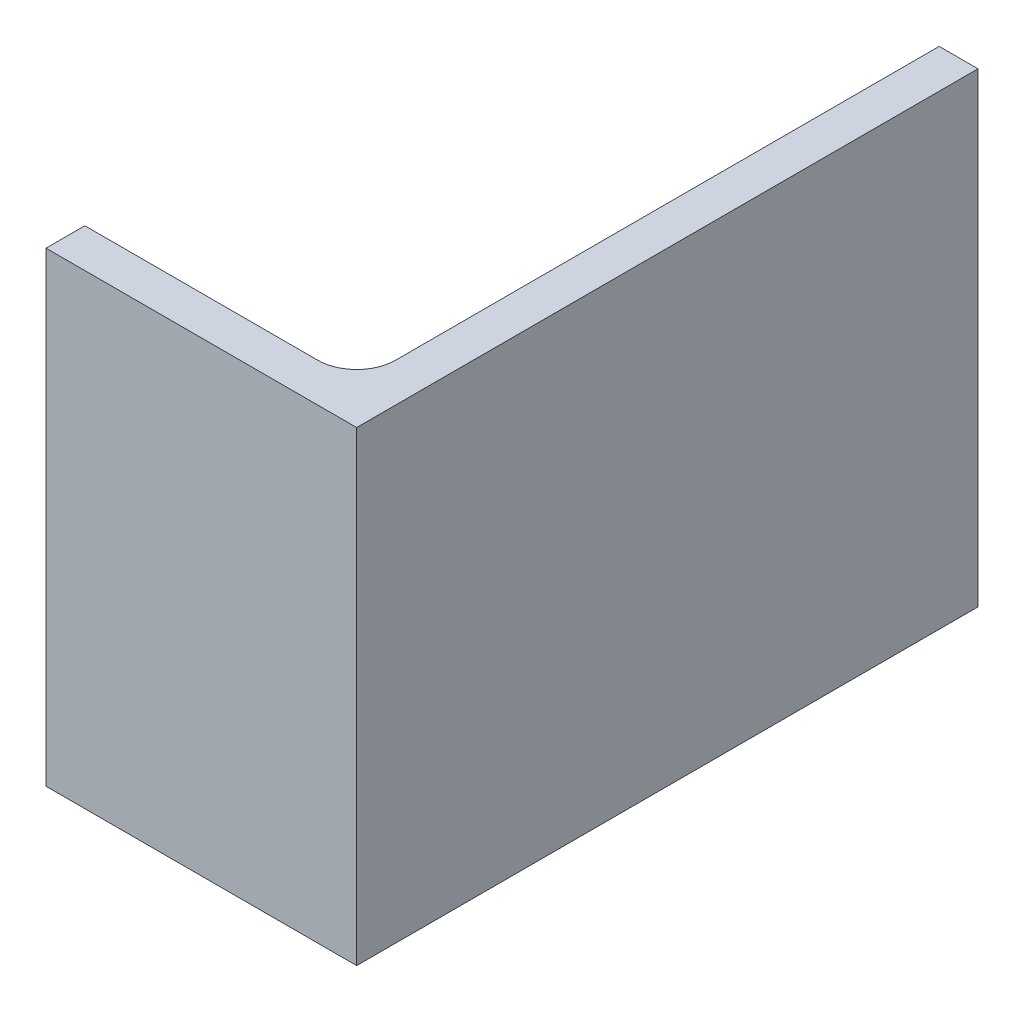
ISO-10303-21;
HEADER;
FILE_DESCRIPTION(('STEP AP214'),'2;1');
FILE_NAME('part.step','',(''),(''),'','','');
FILE_SCHEMA(('AUTOMOTIVE_DESIGN { 1 0 10303 214 1 1 1 1 }'));
ENDSEC;
DATA;
#1=APPLICATION_CONTEXT('core data for automotive mechanical design processes');
#2=APPLICATION_PROTOCOL_DEFINITION('international standard','automotive_design',2000,#1);
#3=PRODUCT_CONTEXT('',#1,'mechanical');
#4=PRODUCT('Part','Part','',(#3));
#5=PRODUCT_RELATED_PRODUCT_CATEGORY('part','',(#4));
#6=PRODUCT_DEFINITION_FORMATION('','',#4);
#7=PRODUCT_DEFINITION_CONTEXT('part definition',#1,'design');
#8=PRODUCT_DEFINITION('design','',#6,#7);
#9=PRODUCT_DEFINITION_SHAPE('','',#8);
#10=(LENGTH_UNIT() NAMED_UNIT(*) SI_UNIT(.MILLI.,.METRE.));
#11=(NAMED_UNIT(*) PLANE_ANGLE_UNIT() SI_UNIT($,.RADIAN.));
#12=(NAMED_UNIT(*) SI_UNIT($,.STERADIAN.) SOLID_ANGLE_UNIT());
#13=UNCERTAINTY_MEASURE_WITH_UNIT(LENGTH_MEASURE(1.E-05),#10,'distance_accuracy_value','');
#14=(GEOMETRIC_REPRESENTATION_CONTEXT(3) GLOBAL_UNCERTAINTY_ASSIGNED_CONTEXT((#13)) GLOBAL_UNIT_ASSIGNED_CONTEXT((#10,
#11,#12)) REPRESENTATION_CONTEXT('',''));
#15=CARTESIAN_POINT('',(0.,0.,0.));
#16=DIRECTION('',(0.,0.,1.));
#17=DIRECTION('',(1.,0.,0.));
#18=AXIS2_PLACEMENT_3D('',#15,#16,#17);
#19=CARTESIAN_POINT('',(-12.7,19.05,-50.8));
#20=DIRECTION('',(-1.,0.,0.));
#21=DIRECTION('',(0.,-1.,0.));
#22=AXIS2_PLACEMENT_3D('',#19,#20,#21);
#23=PLANE('',#22);
#24=DIRECTION('',(0.,0.,1.));
#25=VECTOR('',#24,1.);
#26=CARTESIAN_POINT('',(-12.7,19.05,-50.8));
#27=LINE('',#26,#25);
#28=CARTESIAN_POINT('',(-12.7,19.05,-3.175));
#29=VERTEX_POINT('',#28);
#30=CARTESIAN_POINT('',(-12.7,19.05,0.));
#31=VERTEX_POINT('',#30);
#32=EDGE_CURVE('E178',#29,#31,#27,.T.);
#33=ORIENTED_EDGE('',*,*,#32,.F.);
#34=DIRECTION('',(0.,-1.,0.));
#35=VECTOR('',#34,1.);
#36=CARTESIAN_POINT('',(-12.7,0.,-3.175));
#37=LINE('',#36,#35);
#38=CARTESIAN_POINT('',(-12.7,-12.7,-3.175));
#39=VERTEX_POINT('',#38);
#40=EDGE_CURVE('E216',#29,#39,#37,.T.);
#41=ORIENTED_EDGE('',*,*,#40,.T.);
#42=CARTESIAN_POINT('',(-12.7,-12.7,-6.35));
#43=DIRECTION('',(-1.,0.,0.));
#44=DIRECTION('',(0.,-1.,0.));
#45=AXIS2_PLACEMENT_3D('',#42,#43,#44);
#46=CIRCLE('',#45,3.175);
#47=CARTESIAN_POINT('',(-12.7,-15.875,-6.35));
#48=VERTEX_POINT('',#47);
#49=EDGE_CURVE('E136',#39,#48,#46,.F.);
#50=ORIENTED_EDGE('',*,*,#49,.T.);
#51=DIRECTION('',(0.,0.,1.));
#52=VECTOR('',#51,1.);
#53=CARTESIAN_POINT('',(-12.7,-15.875,-50.8));
#54=LINE('',#53,#52);
#55=CARTESIAN_POINT('',(-12.7,-15.875,-50.8));
#56=VERTEX_POINT('',#55);
#57=EDGE_CURVE('E121',#56,#48,#54,.T.);
#58=ORIENTED_EDGE('',*,*,#57,.F.);
#59=DIRECTION('',(0.,-1.,0.));
#60=VECTOR('',#59,1.);
#61=CARTESIAN_POINT('',(-12.7,19.05,-50.8));
#62=LINE('',#61,#60);
#63=CARTESIAN_POINT('',(-12.7,-19.05,-50.8));
#64=VERTEX_POINT('',#63);
#65=EDGE_CURVE('E132',#56,#64,#62,.T.);
#66=ORIENTED_EDGE('',*,*,#65,.T.);
#67=DIRECTION('',(0.,0.,1.));
#68=VECTOR('',#67,1.);
#69=CARTESIAN_POINT('',(-12.7,-19.05,-50.8));
#70=LINE('',#69,#68);
#71=CARTESIAN_POINT('',(-12.7,-19.05,0.));
#72=VERTEX_POINT('',#71);
#73=EDGE_CURVE('E175',#64,#72,#70,.T.);
#74=ORIENTED_EDGE('',*,*,#73,.T.);
#75=DIRECTION('',(0.,-1.,0.));
#76=VECTOR('',#75,1.);
#77=CARTESIAN_POINT('',(-12.7,19.05,0.));
#78=LINE('',#77,#76);
#79=EDGE_CURVE('E164',#31,#72,#78,.T.);
#80=ORIENTED_EDGE('',*,*,#79,.F.);
#81=EDGE_LOOP('',(#33,#41,#50,#58,#66,#74,#80));
#82=FACE_BOUND('',#81,.T.);
#83=ADVANCED_FACE('F42',(#82),#23,.T.);
#84=CARTESIAN_POINT('',(-12.7,19.05,-50.8));
#85=DIRECTION('',(0.,1.,0.));
#86=DIRECTION('',(0.,0.,1.));
#87=AXIS2_PLACEMENT_3D('',#84,#85,#86);
#88=PLANE('',#87);
#89=DIRECTION('',(0.,0.,1.));
#90=VECTOR('',#89,1.);
#91=CARTESIAN_POINT('',(9.525,19.05,-50.8));
#92=LINE('',#91,#90);
#93=CARTESIAN_POINT('',(9.525,19.05,-50.8));
#94=VERTEX_POINT('',#93);
#95=CARTESIAN_POINT('',(9.525,19.05,-6.35));
#96=VERTEX_POINT('',#95);
#97=EDGE_CURVE('E127',#94,#96,#92,.T.);
#98=ORIENTED_EDGE('',*,*,#97,.T.);
#99=CARTESIAN_POINT('',(6.35,19.05,-6.35));
#100=DIRECTION('',(0.,1.,0.));
#101=DIRECTION('',(0.,0.,1.));
#102=AXIS2_PLACEMENT_3D('',#99,#100,#101);
#103=CIRCLE('',#102,3.175);
#104=CARTESIAN_POINT('',(6.35,19.05,-3.175));
#105=VERTEX_POINT('',#104);
#106=EDGE_CURVE('E52',#96,#105,#103,.F.);
#107=ORIENTED_EDGE('',*,*,#106,.T.);
#108=DIRECTION('',(-1.,0.,0.));
#109=VECTOR('',#108,1.);
#110=CARTESIAN_POINT('',(0.,19.05,-3.175));
#111=LINE('',#110,#109);
#112=EDGE_CURVE('E213',#105,#29,#111,.T.);
#113=ORIENTED_EDGE('',*,*,#112,.T.);
#114=ORIENTED_EDGE('',*,*,#32,.T.);
#115=DIRECTION('',(-1.,0.,0.));
#116=VECTOR('',#115,1.);
#117=CARTESIAN_POINT('',(-12.7,19.05,0.));
#118=LINE('',#117,#116);
#119=CARTESIAN_POINT('',(12.7,19.05,0.));
#120=VERTEX_POINT('',#119);
#121=EDGE_CURVE('E160',#120,#31,#118,.T.);
#122=ORIENTED_EDGE('',*,*,#121,.F.);
#123=DIRECTION('',(0.,0.,1.));
#124=VECTOR('',#123,1.);
#125=CARTESIAN_POINT('',(12.7,19.05,-50.8));
#126=LINE('',#125,#124);
#127=CARTESIAN_POINT('',(12.7,19.05,-50.8));
#128=VERTEX_POINT('',#127);
#129=EDGE_CURVE('E150',#128,#120,#126,.T.);
#130=ORIENTED_EDGE('',*,*,#129,.F.);
#131=DIRECTION('',(-1.,0.,0.));
#132=VECTOR('',#131,1.);
#133=CARTESIAN_POINT('',(-12.7,19.05,-50.8));
#134=LINE('',#133,#132);
#135=EDGE_CURVE('E146',#128,#94,#134,.T.);
#136=ORIENTED_EDGE('',*,*,#135,.T.);
#137=EDGE_LOOP('',(#98,#107,#113,#114,#122,#130,#136));
#138=FACE_BOUND('',#137,.T.);
#139=ADVANCED_FACE('F239',(#138),#88,.T.);
#140=CARTESIAN_POINT('',(12.7,19.05,-50.8));
#141=DIRECTION('',(1.,0.,0.));
#142=DIRECTION('',(0.,1.,0.));
#143=AXIS2_PLACEMENT_3D('',#140,#141,#142);
#144=PLANE('',#143);
#145=DIRECTION('',(0.,1.,0.));
#146=VECTOR('',#145,1.);
#147=CARTESIAN_POINT('',(12.7,19.05,0.));
#148=LINE('',#147,#146);
#149=CARTESIAN_POINT('',(12.7,-19.05,0.));
#150=VERTEX_POINT('',#149);
#151=EDGE_CURVE('E138',#150,#120,#148,.T.);
#152=ORIENTED_EDGE('',*,*,#151,.F.);
#153=DIRECTION('',(0.,0.,1.));
#154=VECTOR('',#153,1.);
#155=CARTESIAN_POINT('',(12.7,-19.05,-50.8));
#156=LINE('',#155,#154);
#157=CARTESIAN_POINT('',(12.7,-19.05,-50.8));
#158=VERTEX_POINT('',#157);
#159=EDGE_CURVE('E172',#158,#150,#156,.T.);
#160=ORIENTED_EDGE('',*,*,#159,.F.);
#161=DIRECTION('',(0.,1.,0.));
#162=VECTOR('',#161,1.);
#163=CARTESIAN_POINT('',(12.7,19.05,-50.8));
#164=LINE('',#163,#162);
#165=EDGE_CURVE('E153',#158,#128,#164,.T.);
#166=ORIENTED_EDGE('',*,*,#165,.T.);
#167=ORIENTED_EDGE('',*,*,#129,.T.);
#168=EDGE_LOOP('',(#152,#160,#166,#167));
#169=FACE_BOUND('',#168,.T.);
#170=ADVANCED_FACE('F230',(#169),#144,.T.);
#171=CARTESIAN_POINT('',(-12.7,-19.05,-50.8));
#172=DIRECTION('',(0.,-1.,0.));
#173=DIRECTION('',(0.,0.,-1.));
#174=AXIS2_PLACEMENT_3D('',#171,#172,#173);
#175=PLANE('',#174);
#176=DIRECTION('',(1.,0.,0.));
#177=VECTOR('',#176,1.);
#178=CARTESIAN_POINT('',(-12.7,-19.05,0.));
#179=LINE('',#178,#177);
#180=EDGE_CURVE('E168',#72,#150,#179,.T.);
#181=ORIENTED_EDGE('',*,*,#180,.F.);
#182=ORIENTED_EDGE('',*,*,#73,.F.);
#183=DIRECTION('',(1.,0.,0.));
#184=VECTOR('',#183,1.);
#185=CARTESIAN_POINT('',(-12.7,-19.05,-50.8));
#186=LINE('',#185,#184);
#187=EDGE_CURVE('E144',#64,#158,#186,.T.);
#188=ORIENTED_EDGE('',*,*,#187,.T.);
#189=ORIENTED_EDGE('',*,*,#159,.T.);
#190=EDGE_LOOP('',(#181,#182,#188,#189));
#191=FACE_BOUND('',#190,.T.);
#192=ADVANCED_FACE('F235',(#191),#175,.T.);
#193=CARTESIAN_POINT('',(0.,0.,-50.8));
#194=DIRECTION('',(0.,0.,1.));
#195=DIRECTION('',(1.,0.,0.));
#196=AXIS2_PLACEMENT_3D('',#193,#194,#195);
#197=PLANE('',#196);
#198=DIRECTION('',(1.,0.,0.));
#199=VECTOR('',#198,1.);
#200=CARTESIAN_POINT('',(0.,-15.875,-50.8));
#201=LINE('',#200,#199);
#202=CARTESIAN_POINT('',(6.35,-15.875,-50.8));
#203=VERTEX_POINT('',#202);
#204=EDGE_CURVE('E117',#56,#203,#201,.T.);
#205=ORIENTED_EDGE('',*,*,#204,.T.);
#206=CARTESIAN_POINT('',(6.35,-12.7,-50.8));
#207=DIRECTION('',(0.,0.,1.));
#208=DIRECTION('',(1.,0.,0.));
#209=AXIS2_PLACEMENT_3D('',#206,#207,#208);
#210=CIRCLE('',#209,3.175);
#211=CARTESIAN_POINT('',(9.525,-12.7,-50.8));
#212=VERTEX_POINT('',#211);
#213=EDGE_CURVE('E11',#203,#212,#210,.T.);
#214=ORIENTED_EDGE('',*,*,#213,.T.);
#215=DIRECTION('',(0.,1.,0.));
#216=VECTOR('',#215,1.);
#217=CARTESIAN_POINT('',(9.525,0.,-50.8));
#218=LINE('',#217,#216);
#219=EDGE_CURVE('E128',#212,#94,#218,.T.);
#220=ORIENTED_EDGE('',*,*,#219,.T.);
#221=ORIENTED_EDGE('',*,*,#135,.F.);
#222=ORIENTED_EDGE('',*,*,#165,.F.);
#223=ORIENTED_EDGE('',*,*,#187,.F.);
#224=ORIENTED_EDGE('',*,*,#65,.F.);
#225=EDGE_LOOP('',(#205,#214,#220,#221,#222,#223,#224));
#226=FACE_BOUND('',#225,.T.);
#227=ADVANCED_FACE('F141',(#226),#197,.F.);
#228=CARTESIAN_POINT('',(0.,0.,0.));
#229=DIRECTION('',(0.,0.,1.));
#230=DIRECTION('',(1.,0.,0.));
#231=AXIS2_PLACEMENT_3D('',#228,#229,#230);
#232=PLANE('',#231);
#233=ORIENTED_EDGE('',*,*,#151,.T.);
#234=ORIENTED_EDGE('',*,*,#121,.T.);
#235=ORIENTED_EDGE('',*,*,#79,.T.);
#236=ORIENTED_EDGE('',*,*,#180,.T.);
#237=EDGE_LOOP('',(#233,#234,#235,#236));
#238=FACE_BOUND('',#237,.T.);
#239=ADVANCED_FACE('F238',(#238),#232,.T.);
#240=CARTESIAN_POINT('',(9.525,19.05,-50.8));
#241=DIRECTION('',(1.,0.,0.));
#242=DIRECTION('',(0.,1.,0.));
#243=AXIS2_PLACEMENT_3D('',#240,#241,#242);
#244=PLANE('',#243);
#245=DIRECTION('',(0.,0.,1.));
#246=VECTOR('',#245,1.);
#247=CARTESIAN_POINT('',(9.525,-12.7,-3.175));
#248=LINE('',#247,#246);
#249=CARTESIAN_POINT('',(9.525,-12.7,-6.35));
#250=VERTEX_POINT('',#249);
#251=EDGE_CURVE('E60',#212,#250,#248,.T.);
#252=ORIENTED_EDGE('',*,*,#251,.T.);
#253=DIRECTION('',(0.,1.,0.));
#254=VECTOR('',#253,1.);
#255=CARTESIAN_POINT('',(9.525,19.05,-6.35));
#256=LINE('',#255,#254);
#257=EDGE_CURVE('E196',#250,#96,#256,.T.);
#258=ORIENTED_EDGE('',*,*,#257,.T.);
#259=ORIENTED_EDGE('',*,*,#97,.F.);
#260=ORIENTED_EDGE('',*,*,#219,.F.);
#261=EDGE_LOOP('',(#252,#258,#259,#260));
#262=FACE_BOUND('',#261,.T.);
#263=ADVANCED_FACE('F274',(#262),#244,.F.);
#264=CARTESIAN_POINT('',(-12.7,-15.875,-50.8));
#265=DIRECTION('',(0.,-1.,0.));
#266=DIRECTION('',(0.,0.,-1.));
#267=AXIS2_PLACEMENT_3D('',#264,#265,#266);
#268=PLANE('',#267);
#269=ORIENTED_EDGE('',*,*,#57,.T.);
#270=DIRECTION('',(1.,0.,0.));
#271=VECTOR('',#270,1.);
#272=CARTESIAN_POINT('',(9.525,-15.875,-6.35));
#273=LINE('',#272,#271);
#274=CARTESIAN_POINT('',(6.35,-15.875,-6.35));
#275=VERTEX_POINT('',#274);
#276=EDGE_CURVE('E185',#48,#275,#273,.T.);
#277=ORIENTED_EDGE('',*,*,#276,.T.);
#278=DIRECTION('',(0.,0.,1.));
#279=VECTOR('',#278,1.);
#280=CARTESIAN_POINT('',(6.35,-15.875,-50.8));
#281=LINE('',#280,#279);
#282=EDGE_CURVE('E124',#275,#203,#281,.F.);
#283=ORIENTED_EDGE('',*,*,#282,.T.);
#284=ORIENTED_EDGE('',*,*,#204,.F.);
#285=EDGE_LOOP('',(#269,#277,#283,#284));
#286=FACE_BOUND('',#285,.T.);
#287=ADVANCED_FACE('F119',(#286),#268,.F.);
#288=CARTESIAN_POINT('',(0.,0.,-3.175));
#289=DIRECTION('',(0.,0.,1.));
#290=DIRECTION('',(1.,0.,0.));
#291=AXIS2_PLACEMENT_3D('',#288,#289,#290);
#292=PLANE('',#291);
#293=DIRECTION('',(0.,1.,0.));
#294=VECTOR('',#293,1.);
#295=CARTESIAN_POINT('',(6.35,-15.875,-3.175));
#296=LINE('',#295,#294);
#297=CARTESIAN_POINT('',(6.35,-12.7,-3.175));
#298=VERTEX_POINT('',#297);
#299=EDGE_CURVE('E188',#105,#298,#296,.F.);
#300=ORIENTED_EDGE('',*,*,#299,.T.);
#301=DIRECTION('',(1.,0.,0.));
#302=VECTOR('',#301,1.);
#303=CARTESIAN_POINT('',(-12.7,-12.7,-3.175));
#304=LINE('',#303,#302);
#305=EDGE_CURVE('E191',#298,#39,#304,.F.);
#306=ORIENTED_EDGE('',*,*,#305,.T.);
#307=ORIENTED_EDGE('',*,*,#40,.F.);
#308=ORIENTED_EDGE('',*,*,#112,.F.);
#309=EDGE_LOOP('',(#300,#306,#307,#308));
#310=FACE_BOUND('',#309,.T.);
#311=ADVANCED_FACE('F276',(#310),#292,.F.);
#312=CARTESIAN_POINT('',(6.35,-12.7,-50.8));
#313=DIRECTION('',(0.,0.,-1.));
#314=DIRECTION('',(-1.,0.,0.));
#315=AXIS2_PLACEMENT_3D('',#312,#313,#314);
#316=CYLINDRICAL_SURFACE('',#315,3.175);
#317=ORIENTED_EDGE('',*,*,#213,.F.);
#318=ORIENTED_EDGE('',*,*,#282,.F.);
#319=CARTESIAN_POINT('',(6.35,-12.7,-6.35));
#320=DIRECTION('',(0.,0.,-1.));
#321=DIRECTION('',(-1.,0.,0.));
#322=AXIS2_PLACEMENT_3D('',#319,#320,#321);
#323=CIRCLE('',#322,3.175);
#324=EDGE_CURVE('E46',#250,#275,#323,.T.);
#325=ORIENTED_EDGE('',*,*,#324,.F.);
#326=ORIENTED_EDGE('',*,*,#251,.F.);
#327=EDGE_LOOP('',(#317,#318,#325,#326));
#328=FACE_BOUND('',#327,.T.);
#329=ADVANCED_FACE('F44',(#328),#316,.F.);
#330=CARTESIAN_POINT('',(6.35,19.05,-6.35));
#331=DIRECTION('',(0.,-1.,0.));
#332=DIRECTION('',(1.,0.,0.));
#333=AXIS2_PLACEMENT_3D('',#330,#331,#332);
#334=CYLINDRICAL_SURFACE('',#333,3.175);
#335=ORIENTED_EDGE('',*,*,#106,.F.);
#336=ORIENTED_EDGE('',*,*,#257,.F.);
#337=CARTESIAN_POINT('',(6.35,-12.7,-6.35));
#338=DIRECTION('',(0.,1.,0.));
#339=DIRECTION('',(0.,0.,1.));
#340=AXIS2_PLACEMENT_3D('',#337,#338,#339);
#341=CIRCLE('',#340,3.175);
#342=EDGE_CURVE('E205',#298,#250,#341,.T.);
#343=ORIENTED_EDGE('',*,*,#342,.F.);
#344=ORIENTED_EDGE('',*,*,#299,.F.);
#345=EDGE_LOOP('',(#335,#336,#343,#344));
#346=FACE_BOUND('',#345,.T.);
#347=ADVANCED_FACE('F246',(#346),#334,.F.);
#348=CARTESIAN_POINT('',(6.35,-12.7,-6.35));
#349=DIRECTION('',(1.,0.,0.));
#350=DIRECTION('',(0.,0.,-1.));
#351=AXIS2_PLACEMENT_3D('',#348,#349,#350);
#352=SPHERICAL_SURFACE('',#351,3.175);
#353=ORIENTED_EDGE('',*,*,#342,.T.);
#354=ORIENTED_EDGE('',*,*,#324,.T.);
#355=CARTESIAN_POINT('',(6.35,-12.7,-6.35));
#356=DIRECTION('',(-1.,0.,0.));
#357=DIRECTION('',(0.,0.,1.));
#358=AXIS2_PLACEMENT_3D('',#355,#356,#357);
#359=CIRCLE('',#358,3.175);
#360=EDGE_CURVE('E203',#298,#275,#359,.F.);
#361=ORIENTED_EDGE('',*,*,#360,.F.);
#362=EDGE_LOOP('',(#353,#354,#361));
#363=FACE_BOUND('',#362,.T.);
#364=ADVANCED_FACE('F244',(#363),#352,.F.);
#365=CARTESIAN_POINT('',(-12.7,-12.7,-6.35));
#366=DIRECTION('',(-1.,0.,0.));
#367=DIRECTION('',(0.,0.,1.));
#368=AXIS2_PLACEMENT_3D('',#365,#366,#367);
#369=CYLINDRICAL_SURFACE('',#368,3.175);
#370=ORIENTED_EDGE('',*,*,#49,.F.);
#371=ORIENTED_EDGE('',*,*,#305,.F.);
#372=ORIENTED_EDGE('',*,*,#360,.T.);
#373=ORIENTED_EDGE('',*,*,#276,.F.);
#374=EDGE_LOOP('',(#370,#371,#372,#373));
#375=FACE_BOUND('',#374,.T.);
#376=ADVANCED_FACE('F243',(#375),#369,.F.);
#377=CLOSED_SHELL('',(#83,#139,#170,#192,#227,#239,#263,#287,#311,#329,#347,#364,#376));
#378=MANIFOLD_SOLID_BREP('B2',#377);
#379=ADVANCED_BREP_SHAPE_REPRESENTATION('',(#18,#378),#14);
#380=SHAPE_DEFINITION_REPRESENTATION(#9,#379);
ENDSEC;
END-ISO-10303-21;
